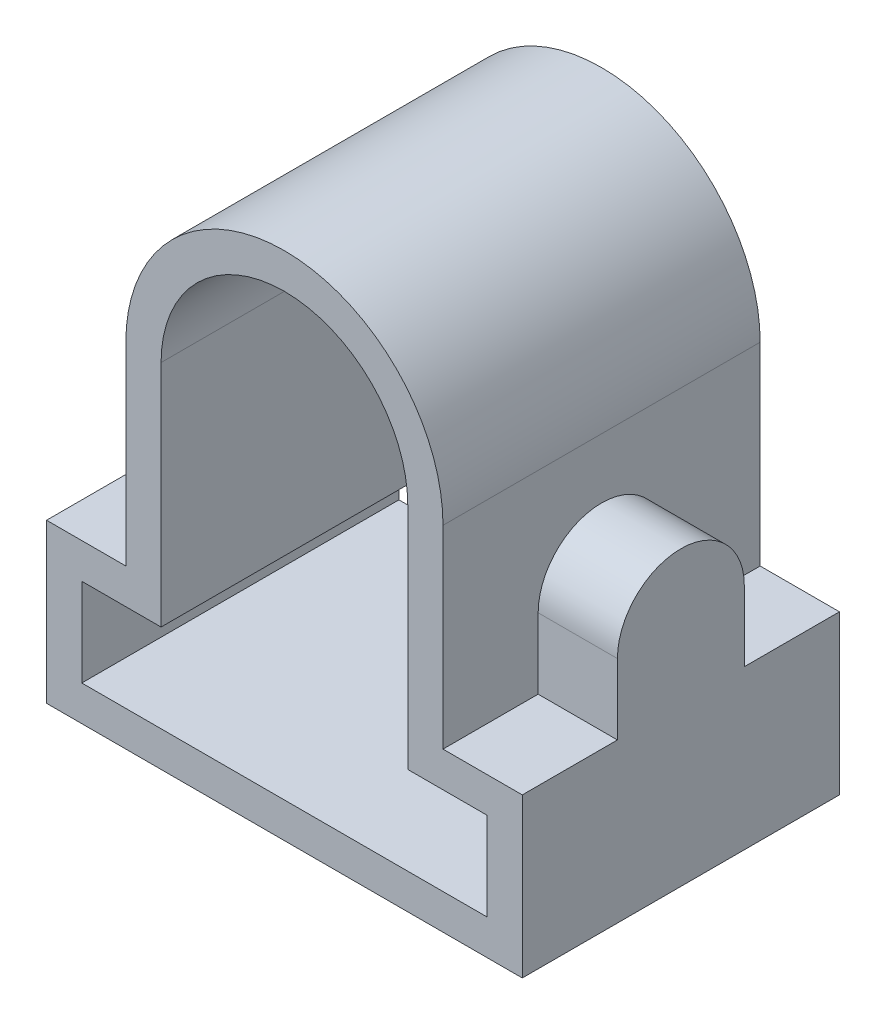
ISO-10303-21;
HEADER;
FILE_DESCRIPTION(('STEP AP214'),'2;1');
FILE_NAME('part.step','',(''),(''),'','','');
FILE_SCHEMA(('AUTOMOTIVE_DESIGN { 1 0 10303 214 1 1 1 1 }'));
ENDSEC;
DATA;
#1=APPLICATION_CONTEXT('core data for automotive mechanical design processes');
#2=APPLICATION_PROTOCOL_DEFINITION('international standard','automotive_design',2000,#1);
#3=PRODUCT_CONTEXT('',#1,'mechanical');
#4=PRODUCT('Part','Part','',(#3));
#5=PRODUCT_RELATED_PRODUCT_CATEGORY('part','',(#4));
#6=PRODUCT_DEFINITION_FORMATION('','',#4);
#7=PRODUCT_DEFINITION_CONTEXT('part definition',#1,'design');
#8=PRODUCT_DEFINITION('design','',#6,#7);
#9=PRODUCT_DEFINITION_SHAPE('','',#8);
#10=(LENGTH_UNIT() NAMED_UNIT(*) SI_UNIT(.MILLI.,.METRE.));
#11=(NAMED_UNIT(*) PLANE_ANGLE_UNIT() SI_UNIT($,.RADIAN.));
#12=(NAMED_UNIT(*) SI_UNIT($,.STERADIAN.) SOLID_ANGLE_UNIT());
#13=UNCERTAINTY_MEASURE_WITH_UNIT(LENGTH_MEASURE(1.E-05),#10,'distance_accuracy_value','');
#14=(GEOMETRIC_REPRESENTATION_CONTEXT(3) GLOBAL_UNCERTAINTY_ASSIGNED_CONTEXT((#13)) GLOBAL_UNIT_ASSIGNED_CONTEXT((#10,
#11,#12)) REPRESENTATION_CONTEXT('',''));
#15=CARTESIAN_POINT('',(0.,0.,0.));
#16=DIRECTION('',(0.,0.,1.));
#17=DIRECTION('',(1.,0.,0.));
#18=AXIS2_PLACEMENT_3D('',#15,#16,#17);
#19=CARTESIAN_POINT('',(67.5,45.,45.));
#20=DIRECTION('',(0.,-1.,0.));
#21=DIRECTION('',(0.,0.,-1.));
#22=AXIS2_PLACEMENT_3D('',#19,#20,#21);
#23=PLANE('',#22);
#24=DIRECTION('',(1.,0.,0.));
#25=VECTOR('',#24,1.);
#26=CARTESIAN_POINT('',(-7.34500931320961,45.,-18.));
#27=LINE('',#26,#25);
#28=CARTESIAN_POINT('',(45.,45.,-18.));
#29=VERTEX_POINT('',#28);
#30=CARTESIAN_POINT('',(67.5,45.,-18.));
#31=VERTEX_POINT('',#30);
#32=EDGE_CURVE('E59',#29,#31,#27,.T.);
#33=ORIENTED_EDGE('',*,*,#32,.T.);
#34=DIRECTION('',(0.,0.,-1.));
#35=VECTOR('',#34,1.);
#36=CARTESIAN_POINT('',(67.5,45.,45.));
#37=LINE('',#36,#35);
#38=CARTESIAN_POINT('',(67.5,45.,-45.));
#39=VERTEX_POINT('',#38);
#40=EDGE_CURVE('E52',#31,#39,#37,.T.);
#41=ORIENTED_EDGE('',*,*,#40,.T.);
#42=DIRECTION('',(-1.,0.,0.));
#43=VECTOR('',#42,1.);
#44=CARTESIAN_POINT('',(67.5,45.,-45.));
#45=LINE('',#44,#43);
#46=CARTESIAN_POINT('',(45.,45.,-45.));
#47=VERTEX_POINT('',#46);
#48=EDGE_CURVE('E336',#39,#47,#45,.T.);
#49=ORIENTED_EDGE('',*,*,#48,.T.);
#50=DIRECTION('',(0.,0.,-1.));
#51=VECTOR('',#50,1.);
#52=CARTESIAN_POINT('',(45.,45.,45.));
#53=LINE('',#52,#51);
#54=EDGE_CURVE('E379',#29,#47,#53,.T.);
#55=ORIENTED_EDGE('',*,*,#54,.F.);
#56=EDGE_LOOP('',(#33,#41,#49,#55));
#57=FACE_BOUND('',#56,.T.);
#58=ADVANCED_FACE('F43',(#57),#23,.F.);
#59=CARTESIAN_POINT('',(0.,100.,45.));
#60=DIRECTION('',(0.,0.,-1.));
#61=DIRECTION('',(-1.,0.,0.));
#62=AXIS2_PLACEMENT_3D('',#59,#60,#61);
#63=PLANE('',#62);
#64=DIRECTION('',(0.,1.,0.));
#65=VECTOR('',#64,1.);
#66=CARTESIAN_POINT('',(67.5,0.,45.));
#67=LINE('',#66,#65);
#68=CARTESIAN_POINT('',(67.5,0.,45.));
#69=VERTEX_POINT('',#68);
#70=CARTESIAN_POINT('',(67.5,45.,45.));
#71=VERTEX_POINT('',#70);
#72=EDGE_CURVE('E307',#69,#71,#67,.T.);
#73=ORIENTED_EDGE('',*,*,#72,.T.);
#74=DIRECTION('',(-1.,0.,0.));
#75=VECTOR('',#74,1.);
#76=CARTESIAN_POINT('',(67.5,45.,45.));
#77=LINE('',#76,#75);
#78=CARTESIAN_POINT('',(45.,45.,45.));
#79=VERTEX_POINT('',#78);
#80=EDGE_CURVE('E311',#71,#79,#77,.T.);
#81=ORIENTED_EDGE('',*,*,#80,.T.);
#82=DIRECTION('',(0.,1.,0.));
#83=VECTOR('',#82,1.);
#84=CARTESIAN_POINT('',(45.,45.,45.));
#85=LINE('',#84,#83);
#86=CARTESIAN_POINT('',(45.,100.,45.));
#87=VERTEX_POINT('',#86);
#88=EDGE_CURVE('E315',#79,#87,#85,.T.);
#89=ORIENTED_EDGE('',*,*,#88,.T.);
#90=CARTESIAN_POINT('',(0.,100.,45.));
#91=DIRECTION('',(0.,0.,1.));
#92=DIRECTION('',(-1.,0.,0.));
#93=AXIS2_PLACEMENT_3D('',#90,#91,#92);
#94=CIRCLE('',#93,45.);
#95=CARTESIAN_POINT('',(-45.,100.,45.));
#96=VERTEX_POINT('',#95);
#97=EDGE_CURVE('E318',#87,#96,#94,.T.);
#98=ORIENTED_EDGE('',*,*,#97,.T.);
#99=DIRECTION('',(0.,-1.,0.));
#100=VECTOR('',#99,1.);
#101=CARTESIAN_POINT('',(-45.,45.,45.));
#102=LINE('',#101,#100);
#103=CARTESIAN_POINT('',(-45.,45.,45.));
#104=VERTEX_POINT('',#103);
#105=EDGE_CURVE('E321',#96,#104,#102,.T.);
#106=ORIENTED_EDGE('',*,*,#105,.T.);
#107=DIRECTION('',(-1.,0.,0.));
#108=VECTOR('',#107,1.);
#109=CARTESIAN_POINT('',(-67.5,45.,45.));
#110=LINE('',#109,#108);
#111=CARTESIAN_POINT('',(-67.5,45.,45.));
#112=VERTEX_POINT('',#111);
#113=EDGE_CURVE('E324',#104,#112,#110,.T.);
#114=ORIENTED_EDGE('',*,*,#113,.T.);
#115=DIRECTION('',(0.,-1.,0.));
#116=VECTOR('',#115,1.);
#117=CARTESIAN_POINT('',(-67.5,0.,45.));
#118=LINE('',#117,#116);
#119=CARTESIAN_POINT('',(-67.5,0.,45.));
#120=VERTEX_POINT('',#119);
#121=EDGE_CURVE('E327',#112,#120,#118,.T.);
#122=ORIENTED_EDGE('',*,*,#121,.T.);
#123=DIRECTION('',(1.,0.,0.));
#124=VECTOR('',#123,1.);
#125=CARTESIAN_POINT('',(67.5,0.,45.));
#126=LINE('',#125,#124);
#127=EDGE_CURVE('E330',#120,#69,#126,.T.);
#128=ORIENTED_EDGE('',*,*,#127,.T.);
#129=EDGE_LOOP('',(#73,#81,#89,#98,#106,#114,#122,#128));
#130=FACE_BOUND('',#129,.T.);
#131=CARTESIAN_POINT('',(0.,100.,45.));
#132=DIRECTION('',(0.,0.,1.));
#133=DIRECTION('',(-1.,0.,0.));
#134=AXIS2_PLACEMENT_3D('',#131,#132,#133);
#135=CIRCLE('',#134,35.);
#136=CARTESIAN_POINT('',(35.,100.,45.));
#137=VERTEX_POINT('',#136);
#138=CARTESIAN_POINT('',(-35.,100.,45.));
#139=VERTEX_POINT('',#138);
#140=EDGE_CURVE('E224',#137,#139,#135,.T.);
#141=ORIENTED_EDGE('',*,*,#140,.F.);
#142=DIRECTION('',(0.,1.,0.));
#143=VECTOR('',#142,1.);
#144=CARTESIAN_POINT('',(35.,35.,45.));
#145=LINE('',#144,#143);
#146=CARTESIAN_POINT('',(35.,35.,45.));
#147=VERTEX_POINT('',#146);
#148=EDGE_CURVE('E247',#147,#137,#145,.T.);
#149=ORIENTED_EDGE('',*,*,#148,.F.);
#150=DIRECTION('',(-1.,0.,0.));
#151=VECTOR('',#150,1.);
#152=CARTESIAN_POINT('',(57.5,35.,45.));
#153=LINE('',#152,#151);
#154=CARTESIAN_POINT('',(57.5,35.,45.));
#155=VERTEX_POINT('',#154);
#156=EDGE_CURVE('E243',#155,#147,#153,.T.);
#157=ORIENTED_EDGE('',*,*,#156,.F.);
#158=DIRECTION('',(0.,1.,0.));
#159=VECTOR('',#158,1.);
#160=CARTESIAN_POINT('',(57.5,9.99999999999998,45.));
#161=LINE('',#160,#159);
#162=CARTESIAN_POINT('',(57.5,9.99999999999998,45.));
#163=VERTEX_POINT('',#162);
#164=EDGE_CURVE('E240',#163,#155,#161,.T.);
#165=ORIENTED_EDGE('',*,*,#164,.F.);
#166=DIRECTION('',(1.,0.,0.));
#167=VECTOR('',#166,1.);
#168=CARTESIAN_POINT('',(57.5,9.99999999999998,45.));
#169=LINE('',#168,#167);
#170=CARTESIAN_POINT('',(-57.5,9.99999999999998,45.));
#171=VERTEX_POINT('',#170);
#172=EDGE_CURVE('E237',#171,#163,#169,.T.);
#173=ORIENTED_EDGE('',*,*,#172,.F.);
#174=DIRECTION('',(0.,-1.,0.));
#175=VECTOR('',#174,1.);
#176=CARTESIAN_POINT('',(-57.5,9.99999999999998,45.));
#177=LINE('',#176,#175);
#178=CARTESIAN_POINT('',(-57.5,35.,45.));
#179=VERTEX_POINT('',#178);
#180=EDGE_CURVE('E234',#179,#171,#177,.T.);
#181=ORIENTED_EDGE('',*,*,#180,.F.);
#182=DIRECTION('',(-1.,0.,0.));
#183=VECTOR('',#182,1.);
#184=CARTESIAN_POINT('',(-57.5,35.,45.));
#185=LINE('',#184,#183);
#186=CARTESIAN_POINT('',(-35.,35.,45.));
#187=VERTEX_POINT('',#186);
#188=EDGE_CURVE('E231',#187,#179,#185,.T.);
#189=ORIENTED_EDGE('',*,*,#188,.F.);
#190=DIRECTION('',(0.,-1.,0.));
#191=VECTOR('',#190,1.);
#192=CARTESIAN_POINT('',(-35.,35.,45.));
#193=LINE('',#192,#191);
#194=EDGE_CURVE('E227',#139,#187,#193,.T.);
#195=ORIENTED_EDGE('',*,*,#194,.F.);
#196=EDGE_LOOP('',(#141,#149,#157,#165,#173,#181,#189,#195));
#197=FACE_BOUND('',#196,.T.);
#198=ADVANCED_FACE('F410',(#130,#197),#63,.F.);
#199=CARTESIAN_POINT('',(0.,100.,-45.));
#200=DIRECTION('',(0.,0.,-1.));
#201=DIRECTION('',(-1.,0.,0.));
#202=AXIS2_PLACEMENT_3D('',#199,#200,#201);
#203=PLANE('',#202);
#204=DIRECTION('',(0.,1.,0.));
#205=VECTOR('',#204,1.);
#206=CARTESIAN_POINT('',(67.5,0.,-45.));
#207=LINE('',#206,#205);
#208=CARTESIAN_POINT('',(67.5,0.,-45.));
#209=VERTEX_POINT('',#208);
#210=EDGE_CURVE('E306',#209,#39,#207,.T.);
#211=ORIENTED_EDGE('',*,*,#210,.F.);
#212=DIRECTION('',(1.,0.,0.));
#213=VECTOR('',#212,1.);
#214=CARTESIAN_POINT('',(67.5,0.,-45.));
#215=LINE('',#214,#213);
#216=CARTESIAN_POINT('',(-67.5,0.,-45.));
#217=VERTEX_POINT('',#216);
#218=EDGE_CURVE('E312',#217,#209,#215,.T.);
#219=ORIENTED_EDGE('',*,*,#218,.F.);
#220=DIRECTION('',(0.,-1.,0.));
#221=VECTOR('',#220,1.);
#222=CARTESIAN_POINT('',(-67.5,0.,-45.));
#223=LINE('',#222,#221);
#224=CARTESIAN_POINT('',(-67.5,45.,-45.));
#225=VERTEX_POINT('',#224);
#226=EDGE_CURVE('E352',#225,#217,#223,.T.);
#227=ORIENTED_EDGE('',*,*,#226,.F.);
#228=DIRECTION('',(-1.,0.,0.));
#229=VECTOR('',#228,1.);
#230=CARTESIAN_POINT('',(-67.5,45.,-45.));
#231=LINE('',#230,#229);
#232=CARTESIAN_POINT('',(-45.,45.,-45.));
#233=VERTEX_POINT('',#232);
#234=EDGE_CURVE('E349',#233,#225,#231,.T.);
#235=ORIENTED_EDGE('',*,*,#234,.F.);
#236=DIRECTION('',(0.,-1.,0.));
#237=VECTOR('',#236,1.);
#238=CARTESIAN_POINT('',(-45.,45.,-45.));
#239=LINE('',#238,#237);
#240=CARTESIAN_POINT('',(-45.,100.,-45.));
#241=VERTEX_POINT('',#240);
#242=EDGE_CURVE('E346',#241,#233,#239,.T.);
#243=ORIENTED_EDGE('',*,*,#242,.F.);
#244=CARTESIAN_POINT('',(0.,100.,-45.));
#245=DIRECTION('',(0.,0.,1.));
#246=DIRECTION('',(-1.,0.,0.));
#247=AXIS2_PLACEMENT_3D('',#244,#245,#246);
#248=CIRCLE('',#247,45.);
#249=CARTESIAN_POINT('',(45.,100.,-45.));
#250=VERTEX_POINT('',#249);
#251=EDGE_CURVE('E343',#250,#241,#248,.T.);
#252=ORIENTED_EDGE('',*,*,#251,.F.);
#253=DIRECTION('',(0.,1.,0.));
#254=VECTOR('',#253,1.);
#255=CARTESIAN_POINT('',(45.,45.,-45.));
#256=LINE('',#255,#254);
#257=EDGE_CURVE('E340',#47,#250,#256,.T.);
#258=ORIENTED_EDGE('',*,*,#257,.F.);
#259=ORIENTED_EDGE('',*,*,#48,.F.);
#260=EDGE_LOOP('',(#211,#219,#227,#235,#243,#252,#258,#259));
#261=FACE_BOUND('',#260,.T.);
#262=DIRECTION('',(0.,1.,0.));
#263=VECTOR('',#262,1.);
#264=CARTESIAN_POINT('',(35.,35.,-45.));
#265=LINE('',#264,#263);
#266=CARTESIAN_POINT('',(35.,35.,-45.));
#267=VERTEX_POINT('',#266);
#268=CARTESIAN_POINT('',(35.,100.,-45.));
#269=VERTEX_POINT('',#268);
#270=EDGE_CURVE('E228',#267,#269,#265,.T.);
#271=ORIENTED_EDGE('',*,*,#270,.T.);
#272=CARTESIAN_POINT('',(0.,100.,-45.));
#273=DIRECTION('',(0.,0.,1.));
#274=DIRECTION('',(-1.,0.,0.));
#275=AXIS2_PLACEMENT_3D('',#272,#273,#274);
#276=CIRCLE('',#275,35.);
#277=CARTESIAN_POINT('',(-35.,100.,-45.));
#278=VERTEX_POINT('',#277);
#279=EDGE_CURVE('E212',#269,#278,#276,.T.);
#280=ORIENTED_EDGE('',*,*,#279,.T.);
#281=DIRECTION('',(0.,-1.,0.));
#282=VECTOR('',#281,1.);
#283=CARTESIAN_POINT('',(-35.,35.,-45.));
#284=LINE('',#283,#282);
#285=CARTESIAN_POINT('',(-35.,35.,-45.));
#286=VERTEX_POINT('',#285);
#287=EDGE_CURVE('E254',#278,#286,#284,.T.);
#288=ORIENTED_EDGE('',*,*,#287,.T.);
#289=DIRECTION('',(-1.,0.,0.));
#290=VECTOR('',#289,1.);
#291=CARTESIAN_POINT('',(-57.5,35.,-45.));
#292=LINE('',#291,#290);
#293=CARTESIAN_POINT('',(-57.5,35.,-45.));
#294=VERTEX_POINT('',#293);
#295=EDGE_CURVE('E258',#286,#294,#292,.T.);
#296=ORIENTED_EDGE('',*,*,#295,.T.);
#297=DIRECTION('',(0.,-1.,0.));
#298=VECTOR('',#297,1.);
#299=CARTESIAN_POINT('',(-57.5,9.99999999999998,-45.));
#300=LINE('',#299,#298);
#301=CARTESIAN_POINT('',(-57.5,9.99999999999998,-45.));
#302=VERTEX_POINT('',#301);
#303=EDGE_CURVE('E262',#294,#302,#300,.T.);
#304=ORIENTED_EDGE('',*,*,#303,.T.);
#305=DIRECTION('',(1.,0.,0.));
#306=VECTOR('',#305,1.);
#307=CARTESIAN_POINT('',(57.5,9.99999999999998,-45.));
#308=LINE('',#307,#306);
#309=CARTESIAN_POINT('',(57.5,9.99999999999998,-45.));
#310=VERTEX_POINT('',#309);
#311=EDGE_CURVE('E266',#302,#310,#308,.T.);
#312=ORIENTED_EDGE('',*,*,#311,.T.);
#313=DIRECTION('',(0.,1.,0.));
#314=VECTOR('',#313,1.);
#315=CARTESIAN_POINT('',(57.5,9.99999999999998,-45.));
#316=LINE('',#315,#314);
#317=CARTESIAN_POINT('',(57.5,35.,-45.));
#318=VERTEX_POINT('',#317);
#319=EDGE_CURVE('E270',#310,#318,#316,.T.);
#320=ORIENTED_EDGE('',*,*,#319,.T.);
#321=DIRECTION('',(-1.,0.,0.));
#322=VECTOR('',#321,1.);
#323=CARTESIAN_POINT('',(57.5,35.,-45.));
#324=LINE('',#323,#322);
#325=EDGE_CURVE('E274',#318,#267,#324,.T.);
#326=ORIENTED_EDGE('',*,*,#325,.T.);
#327=EDGE_LOOP('',(#271,#280,#288,#296,#304,#312,#320,#326));
#328=FACE_BOUND('',#327,.T.);
#329=ADVANCED_FACE('F396',(#261,#328),#203,.T.);
#330=CARTESIAN_POINT('',(67.5,0.,45.));
#331=DIRECTION('',(-1.,0.,0.));
#332=DIRECTION('',(0.,0.,1.));
#333=AXIS2_PLACEMENT_3D('',#330,#331,#332);
#334=PLANE('',#333);
#335=ORIENTED_EDGE('',*,*,#210,.T.);
#336=ORIENTED_EDGE('',*,*,#40,.F.);
#337=DIRECTION('',(0.,-1.,0.));
#338=VECTOR('',#337,1.);
#339=CARTESIAN_POINT('',(67.5,0.,-18.));
#340=LINE('',#339,#338);
#341=CARTESIAN_POINT('',(67.5,65.,-18.));
#342=VERTEX_POINT('',#341);
#343=EDGE_CURVE('E203',#342,#31,#340,.T.);
#344=ORIENTED_EDGE('',*,*,#343,.F.);
#345=CARTESIAN_POINT('',(67.5,65.,0.));
#346=DIRECTION('',(1.,0.,0.));
#347=DIRECTION('',(0.,0.,-1.));
#348=AXIS2_PLACEMENT_3D('',#345,#346,#347);
#349=CIRCLE('',#348,18.);
#350=CARTESIAN_POINT('',(67.5,65.,18.));
#351=VERTEX_POINT('',#350);
#352=EDGE_CURVE('E186',#342,#351,#349,.T.);
#353=ORIENTED_EDGE('',*,*,#352,.T.);
#354=DIRECTION('',(0.,-1.,0.));
#355=VECTOR('',#354,1.);
#356=CARTESIAN_POINT('',(67.5,0.,18.));
#357=LINE('',#356,#355);
#358=CARTESIAN_POINT('',(67.5,45.,18.));
#359=VERTEX_POINT('',#358);
#360=EDGE_CURVE('E194',#351,#359,#357,.T.);
#361=ORIENTED_EDGE('',*,*,#360,.T.);
#362=EDGE_CURVE('E11',#71,#359,#37,.T.);
#363=ORIENTED_EDGE('',*,*,#362,.F.);
#364=ORIENTED_EDGE('',*,*,#72,.F.);
#365=DIRECTION('',(0.,0.,-1.));
#366=VECTOR('',#365,1.);
#367=CARTESIAN_POINT('',(67.5,0.,45.));
#368=LINE('',#367,#366);
#369=EDGE_CURVE('E333',#69,#209,#368,.T.);
#370=ORIENTED_EDGE('',*,*,#369,.T.);
#371=EDGE_LOOP('',(#335,#336,#344,#353,#361,#363,#364,#370));
#372=FACE_BOUND('',#371,.T.);
#373=ADVANCED_FACE('F45',(#372),#334,.F.);
#374=ORIENTED_EDGE('',*,*,#362,.T.);
#375=DIRECTION('',(1.,0.,0.));
#376=VECTOR('',#375,1.);
#377=CARTESIAN_POINT('',(-7.34500931320961,45.,18.));
#378=LINE('',#377,#376);
#379=CARTESIAN_POINT('',(45.,45.,18.));
#380=VERTEX_POINT('',#379);
#381=EDGE_CURVE('E196',#380,#359,#378,.T.);
#382=ORIENTED_EDGE('',*,*,#381,.F.);
#383=EDGE_CURVE('E380',#79,#380,#53,.T.);
#384=ORIENTED_EDGE('',*,*,#383,.F.);
#385=ORIENTED_EDGE('',*,*,#80,.F.);
#386=EDGE_LOOP('',(#374,#382,#384,#385));
#387=FACE_BOUND('',#386,.T.);
#388=ADVANCED_FACE('F414',(#387),#23,.F.);
#389=CARTESIAN_POINT('',(45.,45.,45.));
#390=DIRECTION('',(-1.,0.,0.));
#391=DIRECTION('',(0.,0.,1.));
#392=AXIS2_PLACEMENT_3D('',#389,#390,#391);
#393=PLANE('',#392);
#394=ORIENTED_EDGE('',*,*,#383,.T.);
#395=DIRECTION('',(0.,-1.,0.));
#396=VECTOR('',#395,1.);
#397=CARTESIAN_POINT('',(45.,0.,18.));
#398=LINE('',#397,#396);
#399=CARTESIAN_POINT('',(45.,65.,18.));
#400=VERTEX_POINT('',#399);
#401=EDGE_CURVE('E191',#400,#380,#398,.T.);
#402=ORIENTED_EDGE('',*,*,#401,.F.);
#403=CARTESIAN_POINT('',(45.,65.,0.));
#404=DIRECTION('',(-1.,0.,0.));
#405=DIRECTION('',(0.,0.,1.));
#406=AXIS2_PLACEMENT_3D('',#403,#404,#405);
#407=CIRCLE('',#406,18.);
#408=CARTESIAN_POINT('',(45.,65.,-18.));
#409=VERTEX_POINT('',#408);
#410=EDGE_CURVE('E187',#409,#400,#407,.F.);
#411=ORIENTED_EDGE('',*,*,#410,.F.);
#412=DIRECTION('',(0.,-1.,0.));
#413=VECTOR('',#412,1.);
#414=CARTESIAN_POINT('',(45.,0.,-18.));
#415=LINE('',#414,#413);
#416=EDGE_CURVE('E205',#409,#29,#415,.T.);
#417=ORIENTED_EDGE('',*,*,#416,.T.);
#418=ORIENTED_EDGE('',*,*,#54,.T.);
#419=ORIENTED_EDGE('',*,*,#257,.T.);
#420=DIRECTION('',(0.,0.,-1.));
#421=VECTOR('',#420,1.);
#422=CARTESIAN_POINT('',(45.,100.,45.));
#423=LINE('',#422,#421);
#424=EDGE_CURVE('E376',#87,#250,#423,.T.);
#425=ORIENTED_EDGE('',*,*,#424,.F.);
#426=ORIENTED_EDGE('',*,*,#88,.F.);
#427=EDGE_LOOP('',(#394,#402,#411,#417,#418,#419,#425,#426));
#428=FACE_BOUND('',#427,.T.);
#429=ADVANCED_FACE('F388',(#428),#393,.F.);
#430=CARTESIAN_POINT('',(0.,100.,45.));
#431=DIRECTION('',(0.,0.,-1.));
#432=DIRECTION('',(-1.,0.,0.));
#433=AXIS2_PLACEMENT_3D('',#430,#431,#432);
#434=CYLINDRICAL_SURFACE('',#433,45.);
#435=ORIENTED_EDGE('',*,*,#251,.T.);
#436=DIRECTION('',(0.,0.,-1.));
#437=VECTOR('',#436,1.);
#438=CARTESIAN_POINT('',(-45.,100.,45.));
#439=LINE('',#438,#437);
#440=EDGE_CURVE('E372',#96,#241,#439,.T.);
#441=ORIENTED_EDGE('',*,*,#440,.F.);
#442=ORIENTED_EDGE('',*,*,#97,.F.);
#443=ORIENTED_EDGE('',*,*,#424,.T.);
#444=EDGE_LOOP('',(#435,#441,#442,#443));
#445=FACE_BOUND('',#444,.T.);
#446=ADVANCED_FACE('F402',(#445),#434,.T.);
#447=CARTESIAN_POINT('',(-45.,45.,45.));
#448=DIRECTION('',(1.,0.,0.));
#449=DIRECTION('',(0.,0.,-1.));
#450=AXIS2_PLACEMENT_3D('',#447,#448,#449);
#451=PLANE('',#450);
#452=ORIENTED_EDGE('',*,*,#242,.T.);
#453=DIRECTION('',(0.,0.,-1.));
#454=VECTOR('',#453,1.);
#455=CARTESIAN_POINT('',(-45.,45.,45.));
#456=LINE('',#455,#454);
#457=EDGE_CURVE('E368',#104,#233,#456,.T.);
#458=ORIENTED_EDGE('',*,*,#457,.F.);
#459=ORIENTED_EDGE('',*,*,#105,.F.);
#460=ORIENTED_EDGE('',*,*,#440,.T.);
#461=EDGE_LOOP('',(#452,#458,#459,#460));
#462=FACE_BOUND('',#461,.T.);
#463=ADVANCED_FACE('F406',(#462),#451,.F.);
#464=CARTESIAN_POINT('',(-67.5,45.,45.));
#465=DIRECTION('',(0.,-1.,0.));
#466=DIRECTION('',(0.,0.,-1.));
#467=AXIS2_PLACEMENT_3D('',#464,#465,#466);
#468=PLANE('',#467);
#469=ORIENTED_EDGE('',*,*,#234,.T.);
#470=DIRECTION('',(0.,0.,-1.));
#471=VECTOR('',#470,1.);
#472=CARTESIAN_POINT('',(-67.5,45.,45.));
#473=LINE('',#472,#471);
#474=EDGE_CURVE('E364',#112,#225,#473,.T.);
#475=ORIENTED_EDGE('',*,*,#474,.F.);
#476=ORIENTED_EDGE('',*,*,#113,.F.);
#477=ORIENTED_EDGE('',*,*,#457,.T.);
#478=EDGE_LOOP('',(#469,#475,#476,#477));
#479=FACE_BOUND('',#478,.T.);
#480=ADVANCED_FACE('F441',(#479),#468,.F.);
#481=CARTESIAN_POINT('',(-67.5,0.,45.));
#482=DIRECTION('',(1.,0.,0.));
#483=DIRECTION('',(0.,0.,-1.));
#484=AXIS2_PLACEMENT_3D('',#481,#482,#483);
#485=PLANE('',#484);
#486=ORIENTED_EDGE('',*,*,#226,.T.);
#487=DIRECTION('',(0.,0.,-1.));
#488=VECTOR('',#487,1.);
#489=CARTESIAN_POINT('',(-67.5,0.,45.));
#490=LINE('',#489,#488);
#491=EDGE_CURVE('E360',#120,#217,#490,.T.);
#492=ORIENTED_EDGE('',*,*,#491,.F.);
#493=ORIENTED_EDGE('',*,*,#121,.F.);
#494=ORIENTED_EDGE('',*,*,#474,.T.);
#495=EDGE_LOOP('',(#486,#492,#493,#494));
#496=FACE_BOUND('',#495,.T.);
#497=ADVANCED_FACE('F437',(#496),#485,.F.);
#498=CARTESIAN_POINT('',(67.5,0.,45.));
#499=DIRECTION('',(0.,1.,0.));
#500=DIRECTION('',(0.,0.,1.));
#501=AXIS2_PLACEMENT_3D('',#498,#499,#500);
#502=PLANE('',#501);
#503=ORIENTED_EDGE('',*,*,#218,.T.);
#504=ORIENTED_EDGE('',*,*,#369,.F.);
#505=ORIENTED_EDGE('',*,*,#127,.F.);
#506=ORIENTED_EDGE('',*,*,#491,.T.);
#507=EDGE_LOOP('',(#503,#504,#505,#506));
#508=FACE_BOUND('',#507,.T.);
#509=ADVANCED_FACE('F434',(#508),#502,.F.);
#510=CARTESIAN_POINT('',(0.,100.,45.));
#511=DIRECTION('',(0.,0.,-1.));
#512=DIRECTION('',(-1.,0.,0.));
#513=AXIS2_PLACEMENT_3D('',#510,#511,#512);
#514=CYLINDRICAL_SURFACE('',#513,35.);
#515=ORIENTED_EDGE('',*,*,#279,.F.);
#516=DIRECTION('',(0.,0.,-1.));
#517=VECTOR('',#516,1.);
#518=CARTESIAN_POINT('',(35.,100.,45.));
#519=LINE('',#518,#517);
#520=EDGE_CURVE('E250',#137,#269,#519,.T.);
#521=ORIENTED_EDGE('',*,*,#520,.F.);
#522=ORIENTED_EDGE('',*,*,#140,.T.);
#523=DIRECTION('',(0.,0.,-1.));
#524=VECTOR('',#523,1.);
#525=CARTESIAN_POINT('',(-35.,100.,45.));
#526=LINE('',#525,#524);
#527=EDGE_CURVE('E302',#139,#278,#526,.T.);
#528=ORIENTED_EDGE('',*,*,#527,.T.);
#529=EDGE_LOOP('',(#515,#521,#522,#528));
#530=FACE_BOUND('',#529,.T.);
#531=ADVANCED_FACE('F431',(#530),#514,.F.);
#532=CARTESIAN_POINT('',(-35.,35.,45.));
#533=DIRECTION('',(1.,0.,0.));
#534=DIRECTION('',(0.,0.,-1.));
#535=AXIS2_PLACEMENT_3D('',#532,#533,#534);
#536=PLANE('',#535);
#537=ORIENTED_EDGE('',*,*,#287,.F.);
#538=ORIENTED_EDGE('',*,*,#527,.F.);
#539=ORIENTED_EDGE('',*,*,#194,.T.);
#540=DIRECTION('',(0.,0.,-1.));
#541=VECTOR('',#540,1.);
#542=CARTESIAN_POINT('',(-35.,35.,45.));
#543=LINE('',#542,#541);
#544=EDGE_CURVE('E299',#187,#286,#543,.T.);
#545=ORIENTED_EDGE('',*,*,#544,.T.);
#546=EDGE_LOOP('',(#537,#538,#539,#545));
#547=FACE_BOUND('',#546,.T.);
#548=ADVANCED_FACE('F476',(#547),#536,.T.);
#549=CARTESIAN_POINT('',(-57.5,35.,45.));
#550=DIRECTION('',(0.,-1.,0.));
#551=DIRECTION('',(0.,0.,-1.));
#552=AXIS2_PLACEMENT_3D('',#549,#550,#551);
#553=PLANE('',#552);
#554=ORIENTED_EDGE('',*,*,#295,.F.);
#555=ORIENTED_EDGE('',*,*,#544,.F.);
#556=ORIENTED_EDGE('',*,*,#188,.T.);
#557=DIRECTION('',(0.,0.,-1.));
#558=VECTOR('',#557,1.);
#559=CARTESIAN_POINT('',(-57.5,35.,45.));
#560=LINE('',#559,#558);
#561=EDGE_CURVE('E296',#179,#294,#560,.T.);
#562=ORIENTED_EDGE('',*,*,#561,.T.);
#563=EDGE_LOOP('',(#554,#555,#556,#562));
#564=FACE_BOUND('',#563,.T.);
#565=ADVANCED_FACE('F483',(#564),#553,.T.);
#566=CARTESIAN_POINT('',(-57.5,9.99999999999998,45.));
#567=DIRECTION('',(1.,0.,0.));
#568=DIRECTION('',(0.,0.,-1.));
#569=AXIS2_PLACEMENT_3D('',#566,#567,#568);
#570=PLANE('',#569);
#571=ORIENTED_EDGE('',*,*,#303,.F.);
#572=ORIENTED_EDGE('',*,*,#561,.F.);
#573=ORIENTED_EDGE('',*,*,#180,.T.);
#574=DIRECTION('',(0.,0.,-1.));
#575=VECTOR('',#574,1.);
#576=CARTESIAN_POINT('',(-57.5,9.99999999999998,45.));
#577=LINE('',#576,#575);
#578=EDGE_CURVE('E293',#171,#302,#577,.T.);
#579=ORIENTED_EDGE('',*,*,#578,.T.);
#580=EDGE_LOOP('',(#571,#572,#573,#579));
#581=FACE_BOUND('',#580,.T.);
#582=ADVANCED_FACE('F490',(#581),#570,.T.);
#583=CARTESIAN_POINT('',(57.5,9.99999999999998,45.));
#584=DIRECTION('',(0.,1.,0.));
#585=DIRECTION('',(0.,0.,1.));
#586=AXIS2_PLACEMENT_3D('',#583,#584,#585);
#587=PLANE('',#586);
#588=ORIENTED_EDGE('',*,*,#311,.F.);
#589=ORIENTED_EDGE('',*,*,#578,.F.);
#590=ORIENTED_EDGE('',*,*,#172,.T.);
#591=DIRECTION('',(0.,0.,-1.));
#592=VECTOR('',#591,1.);
#593=CARTESIAN_POINT('',(57.5,9.99999999999998,45.));
#594=LINE('',#593,#592);
#595=EDGE_CURVE('E290',#163,#310,#594,.T.);
#596=ORIENTED_EDGE('',*,*,#595,.T.);
#597=EDGE_LOOP('',(#588,#589,#590,#596));
#598=FACE_BOUND('',#597,.T.);
#599=ADVANCED_FACE('F498',(#598),#587,.T.);
#600=CARTESIAN_POINT('',(57.5,9.99999999999998,45.));
#601=DIRECTION('',(-1.,0.,0.));
#602=DIRECTION('',(0.,0.,1.));
#603=AXIS2_PLACEMENT_3D('',#600,#601,#602);
#604=PLANE('',#603);
#605=ORIENTED_EDGE('',*,*,#319,.F.);
#606=ORIENTED_EDGE('',*,*,#595,.F.);
#607=ORIENTED_EDGE('',*,*,#164,.T.);
#608=DIRECTION('',(0.,0.,-1.));
#609=VECTOR('',#608,1.);
#610=CARTESIAN_POINT('',(57.5,35.,45.));
#611=LINE('',#610,#609);
#612=EDGE_CURVE('E287',#155,#318,#611,.T.);
#613=ORIENTED_EDGE('',*,*,#612,.T.);
#614=EDGE_LOOP('',(#605,#606,#607,#613));
#615=FACE_BOUND('',#614,.T.);
#616=ADVANCED_FACE('F506',(#615),#604,.T.);
#617=CARTESIAN_POINT('',(57.5,35.,45.));
#618=DIRECTION('',(0.,-1.,0.));
#619=DIRECTION('',(0.,0.,-1.));
#620=AXIS2_PLACEMENT_3D('',#617,#618,#619);
#621=PLANE('',#620);
#622=ORIENTED_EDGE('',*,*,#325,.F.);
#623=ORIENTED_EDGE('',*,*,#612,.F.);
#624=ORIENTED_EDGE('',*,*,#156,.T.);
#625=DIRECTION('',(0.,0.,-1.));
#626=VECTOR('',#625,1.);
#627=CARTESIAN_POINT('',(35.,35.,45.));
#628=LINE('',#627,#626);
#629=EDGE_CURVE('E284',#147,#267,#628,.T.);
#630=ORIENTED_EDGE('',*,*,#629,.T.);
#631=EDGE_LOOP('',(#622,#623,#624,#630));
#632=FACE_BOUND('',#631,.T.);
#633=ADVANCED_FACE('F514',(#632),#621,.T.);
#634=CARTESIAN_POINT('',(35.,35.,45.));
#635=DIRECTION('',(-1.,0.,0.));
#636=DIRECTION('',(0.,0.,1.));
#637=AXIS2_PLACEMENT_3D('',#634,#635,#636);
#638=PLANE('',#637);
#639=ORIENTED_EDGE('',*,*,#270,.F.);
#640=ORIENTED_EDGE('',*,*,#629,.F.);
#641=ORIENTED_EDGE('',*,*,#148,.T.);
#642=ORIENTED_EDGE('',*,*,#520,.T.);
#643=EDGE_LOOP('',(#639,#640,#641,#642));
#644=FACE_BOUND('',#643,.T.);
#645=ADVANCED_FACE('F522',(#644),#638,.T.);
#646=CARTESIAN_POINT('',(-7.34500931320961,65.,0.));
#647=DIRECTION('',(1.,0.,0.));
#648=DIRECTION('',(0.,0.,-1.));
#649=AXIS2_PLACEMENT_3D('',#646,#647,#648);
#650=CYLINDRICAL_SURFACE('',#649,18.);
#651=DIRECTION('',(1.,0.,0.));
#652=VECTOR('',#651,1.);
#653=CARTESIAN_POINT('',(-7.34500931320961,65.,-18.));
#654=LINE('',#653,#652);
#655=EDGE_CURVE('E213',#409,#342,#654,.T.);
#656=ORIENTED_EDGE('',*,*,#655,.F.);
#657=ORIENTED_EDGE('',*,*,#410,.T.);
#658=DIRECTION('',(1.,0.,0.));
#659=VECTOR('',#658,1.);
#660=CARTESIAN_POINT('',(-7.34500931320961,65.,18.));
#661=LINE('',#660,#659);
#662=EDGE_CURVE('E181',#400,#351,#661,.T.);
#663=ORIENTED_EDGE('',*,*,#662,.T.);
#664=ORIENTED_EDGE('',*,*,#352,.F.);
#665=EDGE_LOOP('',(#656,#657,#663,#664));
#666=FACE_BOUND('',#665,.T.);
#667=ADVANCED_FACE('F184',(#666),#650,.T.);
#668=CARTESIAN_POINT('',(-7.34500931320961,0.,18.));
#669=DIRECTION('',(0.,0.,1.));
#670=DIRECTION('',(0.,-1.,0.));
#671=AXIS2_PLACEMENT_3D('',#668,#669,#670);
#672=PLANE('',#671);
#673=ORIENTED_EDGE('',*,*,#662,.F.);
#674=ORIENTED_EDGE('',*,*,#401,.T.);
#675=ORIENTED_EDGE('',*,*,#381,.T.);
#676=ORIENTED_EDGE('',*,*,#360,.F.);
#677=EDGE_LOOP('',(#673,#674,#675,#676));
#678=FACE_BOUND('',#677,.T.);
#679=ADVANCED_FACE('F195',(#678),#672,.T.);
#680=CARTESIAN_POINT('',(-7.34500931320961,0.,-18.));
#681=DIRECTION('',(0.,0.,1.));
#682=DIRECTION('',(1.,0.,0.));
#683=AXIS2_PLACEMENT_3D('',#680,#681,#682);
#684=PLANE('',#683);
#685=ORIENTED_EDGE('',*,*,#416,.F.);
#686=ORIENTED_EDGE('',*,*,#655,.T.);
#687=ORIENTED_EDGE('',*,*,#343,.T.);
#688=ORIENTED_EDGE('',*,*,#32,.F.);
#689=EDGE_LOOP('',(#685,#686,#687,#688));
#690=FACE_BOUND('',#689,.T.);
#691=ADVANCED_FACE('F543',(#690),#684,.F.);
#692=CLOSED_SHELL('',(#58,#198,#329,#373,#388,#429,#446,#463,#480,#497,#509,#531,#548,#565,#582,
#599,#616,#633,#645,#667,#679,#691));
#693=MANIFOLD_SOLID_BREP('B2',#692);
#694=ADVANCED_BREP_SHAPE_REPRESENTATION('',(#18,#693),#14);
#695=SHAPE_DEFINITION_REPRESENTATION(#9,#694);
ENDSEC;
END-ISO-10303-21;
